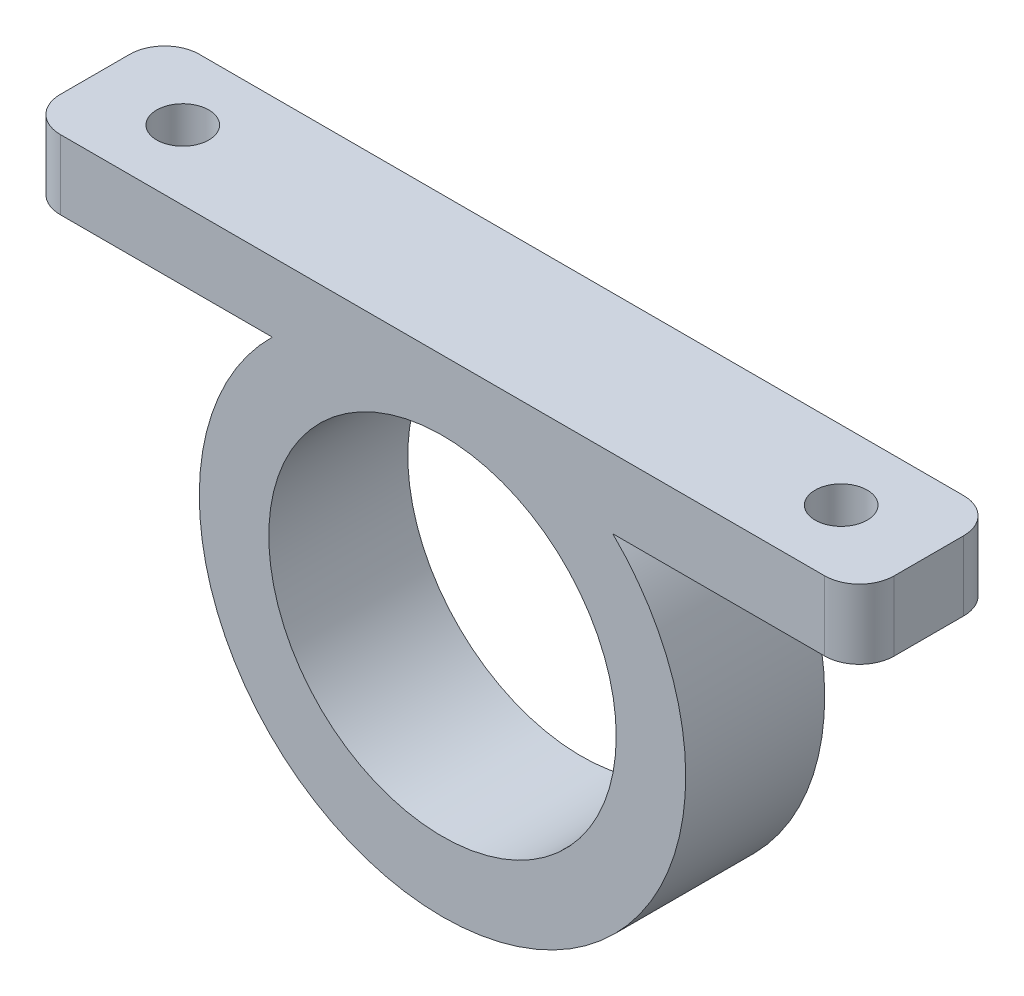
ISO-10303-21;
HEADER;
FILE_DESCRIPTION(('STEP AP214'),'2;1');
FILE_NAME('part.step','',(''),(''),'','','');
FILE_SCHEMA(('AUTOMOTIVE_DESIGN { 1 0 10303 214 1 1 1 1 }'));
ENDSEC;
DATA;
#1=APPLICATION_CONTEXT('core data for automotive mechanical design processes');
#2=APPLICATION_PROTOCOL_DEFINITION('international standard','automotive_design',2000,#1);
#3=PRODUCT_CONTEXT('',#1,'mechanical');
#4=PRODUCT('Part','Part','',(#3));
#5=PRODUCT_RELATED_PRODUCT_CATEGORY('part','',(#4));
#6=PRODUCT_DEFINITION_FORMATION('','',#4);
#7=PRODUCT_DEFINITION_CONTEXT('part definition',#1,'design');
#8=PRODUCT_DEFINITION('design','',#6,#7);
#9=PRODUCT_DEFINITION_SHAPE('','',#8);
#10=(LENGTH_UNIT() NAMED_UNIT(*) SI_UNIT(.MILLI.,.METRE.));
#11=(NAMED_UNIT(*) PLANE_ANGLE_UNIT() SI_UNIT($,.RADIAN.));
#12=(NAMED_UNIT(*) SI_UNIT($,.STERADIAN.) SOLID_ANGLE_UNIT());
#13=UNCERTAINTY_MEASURE_WITH_UNIT(LENGTH_MEASURE(1.E-05),#10,'distance_accuracy_value','');
#14=(GEOMETRIC_REPRESENTATION_CONTEXT(3) GLOBAL_UNCERTAINTY_ASSIGNED_CONTEXT((#13)) GLOBAL_UNIT_ASSIGNED_CONTEXT((#10,
#11,#12)) REPRESENTATION_CONTEXT('',''));
#15=CARTESIAN_POINT('',(0.,0.,0.));
#16=DIRECTION('',(0.,0.,1.));
#17=DIRECTION('',(1.,0.,0.));
#18=AXIS2_PLACEMENT_3D('',#15,#16,#17);
#19=CARTESIAN_POINT('',(0.,0.,8.));
#20=DIRECTION('',(0.,0.,1.));
#21=DIRECTION('',(1.,0.,0.));
#22=AXIS2_PLACEMENT_3D('',#19,#20,#21);
#23=PLANE('',#22);
#24=DIRECTION('',(1.,0.,0.));
#25=VECTOR('',#24,1.);
#26=CARTESIAN_POINT('',(24.,10.,8.));
#27=LINE('',#26,#25);
#28=CARTESIAN_POINT('',(9.79795897113272,9.99999999999999,8.));
#29=VERTEX_POINT('',#28);
#30=CARTESIAN_POINT('',(22.,10.,8.));
#31=VERTEX_POINT('',#30);
#32=EDGE_CURVE('E109',#29,#31,#27,.T.);
#33=ORIENTED_EDGE('',*,*,#32,.T.);
#34=DIRECTION('',(0.,1.,0.));
#35=VECTOR('',#34,1.);
#36=CARTESIAN_POINT('',(22.,14.,8.));
#37=LINE('',#36,#35);
#38=CARTESIAN_POINT('',(22.,14.,8.));
#39=VERTEX_POINT('',#38);
#40=EDGE_CURVE('E140',#31,#39,#37,.T.);
#41=ORIENTED_EDGE('',*,*,#40,.T.);
#42=DIRECTION('',(-1.,0.,0.));
#43=VECTOR('',#42,1.);
#44=CARTESIAN_POINT('',(0.,14.,8.));
#45=LINE('',#44,#43);
#46=CARTESIAN_POINT('',(-22.,14.,8.));
#47=VERTEX_POINT('',#46);
#48=EDGE_CURVE('E122',#39,#47,#45,.T.);
#49=ORIENTED_EDGE('',*,*,#48,.T.);
#50=DIRECTION('',(0.,-1.,0.));
#51=VECTOR('',#50,1.);
#52=CARTESIAN_POINT('',(-22.,10.,8.));
#53=LINE('',#52,#51);
#54=CARTESIAN_POINT('',(-22.,10.,8.));
#55=VERTEX_POINT('',#54);
#56=EDGE_CURVE('E137',#47,#55,#53,.T.);
#57=ORIENTED_EDGE('',*,*,#56,.T.);
#58=DIRECTION('',(1.,0.,0.));
#59=VECTOR('',#58,1.);
#60=CARTESIAN_POINT('',(-24.,10.,8.));
#61=LINE('',#60,#59);
#62=CARTESIAN_POINT('',(-9.79795897113272,10.,8.));
#63=VERTEX_POINT('',#62);
#64=EDGE_CURVE('E128',#55,#63,#61,.T.);
#65=ORIENTED_EDGE('',*,*,#64,.T.);
#66=CARTESIAN_POINT('',(0.,0.,8.));
#67=DIRECTION('',(0.,0.,1.));
#68=DIRECTION('',(1.,0.,0.));
#69=AXIS2_PLACEMENT_3D('',#66,#67,#68);
#70=CIRCLE('',#69,14.);
#71=EDGE_CURVE('E123',#63,#29,#70,.T.);
#72=ORIENTED_EDGE('',*,*,#71,.T.);
#73=EDGE_LOOP('',(#33,#41,#49,#57,#65,#72));
#74=FACE_BOUND('',#73,.T.);
#75=CARTESIAN_POINT('',(0.,0.,8.));
#76=DIRECTION('',(0.,0.,1.));
#77=DIRECTION('',(1.,0.,0.));
#78=AXIS2_PLACEMENT_3D('',#75,#76,#77);
#79=CIRCLE('',#78,10.);
#80=CARTESIAN_POINT('',(10.,0.,8.));
#81=VERTEX_POINT('',#80);
#82=EDGE_CURVE('E207',#81,#81,#79,.T.);
#83=ORIENTED_EDGE('',*,*,#82,.F.);
#84=EDGE_LOOP('',(#83));
#85=FACE_BOUND('',#84,.T.);
#86=ADVANCED_FACE('F33',(#74,#85),#23,.T.);
#87=CARTESIAN_POINT('',(0.,0.,0.));
#88=DIRECTION('',(0.,0.,1.));
#89=DIRECTION('',(1.,0.,0.));
#90=AXIS2_PLACEMENT_3D('',#87,#88,#89);
#91=PLANE('',#90);
#92=DIRECTION('',(-1.,0.,0.));
#93=VECTOR('',#92,1.);
#94=CARTESIAN_POINT('',(0.,14.,0.));
#95=LINE('',#94,#93);
#96=CARTESIAN_POINT('',(22.,14.,0.));
#97=VERTEX_POINT('',#96);
#98=CARTESIAN_POINT('',(-22.,14.,0.));
#99=VERTEX_POINT('',#98);
#100=EDGE_CURVE('E209',#97,#99,#95,.T.);
#101=ORIENTED_EDGE('',*,*,#100,.F.);
#102=DIRECTION('',(0.,1.,0.));
#103=VECTOR('',#102,1.);
#104=CARTESIAN_POINT('',(22.,0.,0.));
#105=LINE('',#104,#103);
#106=CARTESIAN_POINT('',(22.,10.,0.));
#107=VERTEX_POINT('',#106);
#108=EDGE_CURVE('E166',#97,#107,#105,.F.);
#109=ORIENTED_EDGE('',*,*,#108,.T.);
#110=DIRECTION('',(1.,0.,0.));
#111=VECTOR('',#110,1.);
#112=CARTESIAN_POINT('',(24.,10.,0.));
#113=LINE('',#112,#111);
#114=CARTESIAN_POINT('',(9.79795897113272,9.99999999999999,0.));
#115=VERTEX_POINT('',#114);
#116=EDGE_CURVE('E206',#115,#107,#113,.T.);
#117=ORIENTED_EDGE('',*,*,#116,.F.);
#118=CARTESIAN_POINT('',(0.,0.,0.));
#119=DIRECTION('',(0.,0.,1.));
#120=DIRECTION('',(1.,0.,0.));
#121=AXIS2_PLACEMENT_3D('',#118,#119,#120);
#122=CIRCLE('',#121,14.);
#123=CARTESIAN_POINT('',(-9.79795897113272,10.,0.));
#124=VERTEX_POINT('',#123);
#125=EDGE_CURVE('E136',#124,#115,#122,.T.);
#126=ORIENTED_EDGE('',*,*,#125,.F.);
#127=DIRECTION('',(1.,0.,0.));
#128=VECTOR('',#127,1.);
#129=CARTESIAN_POINT('',(-24.,10.,0.));
#130=LINE('',#129,#128);
#131=CARTESIAN_POINT('',(-22.,10.,0.));
#132=VERTEX_POINT('',#131);
#133=EDGE_CURVE('E132',#132,#124,#130,.T.);
#134=ORIENTED_EDGE('',*,*,#133,.F.);
#135=DIRECTION('',(0.,-1.,0.));
#136=VECTOR('',#135,1.);
#137=CARTESIAN_POINT('',(-22.,0.,0.));
#138=LINE('',#137,#136);
#139=EDGE_CURVE('E164',#132,#99,#138,.F.);
#140=ORIENTED_EDGE('',*,*,#139,.T.);
#141=EDGE_LOOP('',(#101,#109,#117,#126,#134,#140));
#142=FACE_BOUND('',#141,.T.);
#143=CARTESIAN_POINT('',(0.,0.,0.));
#144=DIRECTION('',(0.,0.,1.));
#145=DIRECTION('',(1.,0.,0.));
#146=AXIS2_PLACEMENT_3D('',#143,#144,#145);
#147=CIRCLE('',#146,10.);
#148=CARTESIAN_POINT('',(10.,0.,0.));
#149=VERTEX_POINT('',#148);
#150=EDGE_CURVE('E338',#149,#149,#147,.T.);
#151=ORIENTED_EDGE('',*,*,#150,.T.);
#152=EDGE_LOOP('',(#151));
#153=FACE_BOUND('',#152,.T.);
#154=ADVANCED_FACE('F211',(#142,#153),#91,.F.);
#155=CARTESIAN_POINT('',(0.,0.,8.));
#156=DIRECTION('',(0.,0.,-1.));
#157=DIRECTION('',(-1.,0.,0.));
#158=AXIS2_PLACEMENT_3D('',#155,#156,#157);
#159=CYLINDRICAL_SURFACE('',#158,14.);
#160=ORIENTED_EDGE('',*,*,#125,.T.);
#161=DIRECTION('',(0.,0.,-1.));
#162=VECTOR('',#161,1.);
#163=CARTESIAN_POINT('',(9.79795897113272,9.99999999999999,8.));
#164=LINE('',#163,#162);
#165=EDGE_CURVE('E115',#29,#115,#164,.T.);
#166=ORIENTED_EDGE('',*,*,#165,.F.);
#167=ORIENTED_EDGE('',*,*,#71,.F.);
#168=DIRECTION('',(0.,0.,-1.));
#169=VECTOR('',#168,1.);
#170=CARTESIAN_POINT('',(-9.79795897113272,10.,8.));
#171=LINE('',#170,#169);
#172=EDGE_CURVE('E181',#63,#124,#171,.T.);
#173=ORIENTED_EDGE('',*,*,#172,.T.);
#174=EDGE_LOOP('',(#160,#166,#167,#173));
#175=FACE_BOUND('',#174,.T.);
#176=ADVANCED_FACE('F134',(#175),#159,.T.);
#177=CARTESIAN_POINT('',(24.,10.,8.));
#178=DIRECTION('',(0.,1.,0.));
#179=DIRECTION('',(-1.,0.,0.));
#180=AXIS2_PLACEMENT_3D('',#177,#178,#179);
#181=PLANE('',#180);
#182=CARTESIAN_POINT('',(18.9494897427832,10.,4.));
#183=DIRECTION('',(0.,-1.,0.));
#184=DIRECTION('',(0.,0.,-1.));
#185=AXIS2_PLACEMENT_3D('',#182,#183,#184);
#186=CIRCLE('',#185,1.5);
#187=CARTESIAN_POINT('',(18.9494897427832,10.,2.5));
#188=VERTEX_POINT('',#187);
#189=EDGE_CURVE('E330',#188,#188,#186,.T.);
#190=ORIENTED_EDGE('',*,*,#189,.F.);
#191=EDGE_LOOP('',(#190));
#192=FACE_BOUND('',#191,.T.);
#193=DIRECTION('',(0.,0.,-1.));
#194=VECTOR('',#193,1.);
#195=CARTESIAN_POINT('',(24.,10.,8.));
#196=LINE('',#195,#194);
#197=CARTESIAN_POINT('',(24.,10.,6.));
#198=VERTEX_POINT('',#197);
#199=CARTESIAN_POINT('',(24.,10.,2.));
#200=VERTEX_POINT('',#199);
#201=EDGE_CURVE('E138',#198,#200,#196,.T.);
#202=ORIENTED_EDGE('',*,*,#201,.F.);
#203=CARTESIAN_POINT('',(22.,10.,6.));
#204=DIRECTION('',(0.,1.,0.));
#205=DIRECTION('',(-1.,0.,0.));
#206=AXIS2_PLACEMENT_3D('',#203,#204,#205);
#207=CIRCLE('',#206,2.);
#208=EDGE_CURVE('E118',#198,#31,#207,.F.);
#209=ORIENTED_EDGE('',*,*,#208,.T.);
#210=ORIENTED_EDGE('',*,*,#32,.F.);
#211=ORIENTED_EDGE('',*,*,#165,.T.);
#212=ORIENTED_EDGE('',*,*,#116,.T.);
#213=CARTESIAN_POINT('',(22.,9.99999999999999,2.));
#214=DIRECTION('',(0.,1.,0.));
#215=DIRECTION('',(-1.,0.,0.));
#216=AXIS2_PLACEMENT_3D('',#213,#214,#215);
#217=CIRCLE('',#216,2.);
#218=EDGE_CURVE('E161',#107,#200,#217,.F.);
#219=ORIENTED_EDGE('',*,*,#218,.T.);
#220=EDGE_LOOP('',(#202,#209,#210,#211,#212,#219));
#221=FACE_BOUND('',#220,.T.);
#222=ADVANCED_FACE('F112',(#192,#221),#181,.F.);
#223=CARTESIAN_POINT('',(24.,14.,8.));
#224=DIRECTION('',(-1.,0.,0.));
#225=DIRECTION('',(0.,0.,1.));
#226=AXIS2_PLACEMENT_3D('',#223,#224,#225);
#227=PLANE('',#226);
#228=DIRECTION('',(0.,0.,-1.));
#229=VECTOR('',#228,1.);
#230=CARTESIAN_POINT('',(24.,14.,8.));
#231=LINE('',#230,#229);
#232=CARTESIAN_POINT('',(24.,14.,6.));
#233=VERTEX_POINT('',#232);
#234=CARTESIAN_POINT('',(24.,14.,2.));
#235=VERTEX_POINT('',#234);
#236=EDGE_CURVE('E143',#233,#235,#231,.T.);
#237=ORIENTED_EDGE('',*,*,#236,.F.);
#238=DIRECTION('',(0.,1.,0.));
#239=VECTOR('',#238,1.);
#240=CARTESIAN_POINT('',(24.,10.,6.));
#241=LINE('',#240,#239);
#242=EDGE_CURVE('E159',#233,#198,#241,.F.);
#243=ORIENTED_EDGE('',*,*,#242,.T.);
#244=ORIENTED_EDGE('',*,*,#201,.T.);
#245=DIRECTION('',(0.,1.,0.));
#246=VECTOR('',#245,1.);
#247=CARTESIAN_POINT('',(24.,14.,2.));
#248=LINE('',#247,#246);
#249=EDGE_CURVE('E156',#200,#235,#248,.T.);
#250=ORIENTED_EDGE('',*,*,#249,.T.);
#251=EDGE_LOOP('',(#237,#243,#244,#250));
#252=FACE_BOUND('',#251,.T.);
#253=ADVANCED_FACE('F195',(#252),#227,.F.);
#254=CARTESIAN_POINT('',(0.,14.,8.));
#255=DIRECTION('',(0.,-1.,0.));
#256=DIRECTION('',(1.,0.,0.));
#257=AXIS2_PLACEMENT_3D('',#254,#255,#256);
#258=PLANE('',#257);
#259=CARTESIAN_POINT('',(18.9494897427832,14.,4.));
#260=DIRECTION('',(0.,-1.,0.));
#261=DIRECTION('',(0.,0.,-1.));
#262=AXIS2_PLACEMENT_3D('',#259,#260,#261);
#263=CIRCLE('',#262,1.5);
#264=CARTESIAN_POINT('',(18.9494897427832,14.,2.5));
#265=VERTEX_POINT('',#264);
#266=EDGE_CURVE('E327',#265,#265,#263,.T.);
#267=ORIENTED_EDGE('',*,*,#266,.T.);
#268=EDGE_LOOP('',(#267));
#269=FACE_BOUND('',#268,.T.);
#270=CARTESIAN_POINT('',(-18.9494897427832,14.,4.));
#271=DIRECTION('',(0.,-1.,0.));
#272=DIRECTION('',(0.,0.,-1.));
#273=AXIS2_PLACEMENT_3D('',#270,#271,#272);
#274=CIRCLE('',#273,1.5);
#275=CARTESIAN_POINT('',(-18.9494897427832,14.,2.5));
#276=VERTEX_POINT('',#275);
#277=EDGE_CURVE('E335',#276,#276,#274,.T.);
#278=ORIENTED_EDGE('',*,*,#277,.T.);
#279=EDGE_LOOP('',(#278));
#280=FACE_BOUND('',#279,.T.);
#281=ORIENTED_EDGE('',*,*,#48,.F.);
#282=CARTESIAN_POINT('',(22.,14.,6.));
#283=DIRECTION('',(0.,-1.,0.));
#284=DIRECTION('',(1.,0.,0.));
#285=AXIS2_PLACEMENT_3D('',#282,#283,#284);
#286=CIRCLE('',#285,2.);
#287=EDGE_CURVE('E154',#39,#233,#286,.F.);
#288=ORIENTED_EDGE('',*,*,#287,.T.);
#289=ORIENTED_EDGE('',*,*,#236,.T.);
#290=CARTESIAN_POINT('',(22.,14.,2.));
#291=DIRECTION('',(0.,-1.,0.));
#292=DIRECTION('',(1.,0.,0.));
#293=AXIS2_PLACEMENT_3D('',#290,#291,#292);
#294=CIRCLE('',#293,2.);
#295=EDGE_CURVE('E152',#235,#97,#294,.F.);
#296=ORIENTED_EDGE('',*,*,#295,.T.);
#297=ORIENTED_EDGE('',*,*,#100,.T.);
#298=CARTESIAN_POINT('',(-22.,14.,2.));
#299=DIRECTION('',(0.,-1.,0.));
#300=DIRECTION('',(1.,0.,0.));
#301=AXIS2_PLACEMENT_3D('',#298,#299,#300);
#302=CIRCLE('',#301,2.);
#303=CARTESIAN_POINT('',(-24.,14.,2.));
#304=VERTEX_POINT('',#303);
#305=EDGE_CURVE('E150',#99,#304,#302,.F.);
#306=ORIENTED_EDGE('',*,*,#305,.T.);
#307=DIRECTION('',(0.,0.,-1.));
#308=VECTOR('',#307,1.);
#309=CARTESIAN_POINT('',(-24.,14.,8.));
#310=LINE('',#309,#308);
#311=CARTESIAN_POINT('',(-24.,14.,6.));
#312=VERTEX_POINT('',#311);
#313=EDGE_CURVE('E177',#312,#304,#310,.T.);
#314=ORIENTED_EDGE('',*,*,#313,.F.);
#315=CARTESIAN_POINT('',(-22.,14.,6.));
#316=DIRECTION('',(0.,-1.,0.));
#317=DIRECTION('',(1.,0.,0.));
#318=AXIS2_PLACEMENT_3D('',#315,#316,#317);
#319=CIRCLE('',#318,2.);
#320=EDGE_CURVE('E148',#312,#47,#319,.F.);
#321=ORIENTED_EDGE('',*,*,#320,.T.);
#322=EDGE_LOOP('',(#281,#288,#289,#296,#297,#306,#314,#321));
#323=FACE_BOUND('',#322,.T.);
#324=ADVANCED_FACE('F190',(#269,#280,#323),#258,.F.);
#325=CARTESIAN_POINT('',(-24.,14.,8.));
#326=DIRECTION('',(1.,0.,0.));
#327=DIRECTION('',(0.,0.,-1.));
#328=AXIS2_PLACEMENT_3D('',#325,#326,#327);
#329=PLANE('',#328);
#330=ORIENTED_EDGE('',*,*,#313,.T.);
#331=DIRECTION('',(0.,-1.,0.));
#332=VECTOR('',#331,1.);
#333=CARTESIAN_POINT('',(-24.,14.,2.));
#334=LINE('',#333,#332);
#335=CARTESIAN_POINT('',(-24.,10.,2.));
#336=VERTEX_POINT('',#335);
#337=EDGE_CURVE('E170',#304,#336,#334,.T.);
#338=ORIENTED_EDGE('',*,*,#337,.T.);
#339=DIRECTION('',(0.,0.,-1.));
#340=VECTOR('',#339,1.);
#341=CARTESIAN_POINT('',(-24.,10.,8.));
#342=LINE('',#341,#340);
#343=CARTESIAN_POINT('',(-24.,10.,6.));
#344=VERTEX_POINT('',#343);
#345=EDGE_CURVE('E174',#344,#336,#342,.T.);
#346=ORIENTED_EDGE('',*,*,#345,.F.);
#347=DIRECTION('',(0.,-1.,0.));
#348=VECTOR('',#347,1.);
#349=CARTESIAN_POINT('',(-24.,14.,6.));
#350=LINE('',#349,#348);
#351=EDGE_CURVE('E168',#344,#312,#350,.F.);
#352=ORIENTED_EDGE('',*,*,#351,.T.);
#353=EDGE_LOOP('',(#330,#338,#346,#352));
#354=FACE_BOUND('',#353,.T.);
#355=ADVANCED_FACE('F173',(#354),#329,.F.);
#356=CARTESIAN_POINT('',(-24.,10.,8.));
#357=DIRECTION('',(0.,1.,0.));
#358=DIRECTION('',(0.,0.,1.));
#359=AXIS2_PLACEMENT_3D('',#356,#357,#358);
#360=PLANE('',#359);
#361=CARTESIAN_POINT('',(-18.9494897427832,10.,4.));
#362=DIRECTION('',(0.,-1.,0.));
#363=DIRECTION('',(0.,0.,-1.));
#364=AXIS2_PLACEMENT_3D('',#361,#362,#363);
#365=CIRCLE('',#364,1.5);
#366=CARTESIAN_POINT('',(-18.9494897427832,10.,2.5));
#367=VERTEX_POINT('',#366);
#368=EDGE_CURVE('E332',#367,#367,#365,.T.);
#369=ORIENTED_EDGE('',*,*,#368,.F.);
#370=EDGE_LOOP('',(#369));
#371=FACE_BOUND('',#370,.T.);
#372=ORIENTED_EDGE('',*,*,#345,.T.);
#373=CARTESIAN_POINT('',(-22.,10.,2.));
#374=DIRECTION('',(0.,1.,0.));
#375=DIRECTION('',(0.,0.,1.));
#376=AXIS2_PLACEMENT_3D('',#373,#374,#375);
#377=CIRCLE('',#376,2.);
#378=EDGE_CURVE('E11',#336,#132,#377,.F.);
#379=ORIENTED_EDGE('',*,*,#378,.T.);
#380=ORIENTED_EDGE('',*,*,#133,.T.);
#381=ORIENTED_EDGE('',*,*,#172,.F.);
#382=ORIENTED_EDGE('',*,*,#64,.F.);
#383=CARTESIAN_POINT('',(-22.,10.,6.));
#384=DIRECTION('',(0.,1.,0.));
#385=DIRECTION('',(0.,0.,1.));
#386=AXIS2_PLACEMENT_3D('',#383,#384,#385);
#387=CIRCLE('',#386,2.);
#388=EDGE_CURVE('E41',#55,#344,#387,.F.);
#389=ORIENTED_EDGE('',*,*,#388,.T.);
#390=EDGE_LOOP('',(#372,#379,#380,#381,#382,#389));
#391=FACE_BOUND('',#390,.T.);
#392=ADVANCED_FACE('F179',(#371,#391),#360,.F.);
#393=CARTESIAN_POINT('',(0.,0.,8.));
#394=DIRECTION('',(0.,0.,-1.));
#395=DIRECTION('',(-1.,0.,0.));
#396=AXIS2_PLACEMENT_3D('',#393,#394,#395);
#397=CYLINDRICAL_SURFACE('',#396,10.);
#398=ORIENTED_EDGE('',*,*,#82,.T.);
#399=EDGE_LOOP('',(#398));
#400=FACE_BOUND('',#399,.T.);
#401=ORIENTED_EDGE('',*,*,#150,.F.);
#402=EDGE_LOOP('',(#401));
#403=FACE_BOUND('',#402,.T.);
#404=ADVANCED_FACE('F224',(#400,#403),#397,.F.);
#405=CARTESIAN_POINT('',(22.,0.,6.));
#406=DIRECTION('',(0.,-1.,0.));
#407=DIRECTION('',(0.,0.,-1.));
#408=AXIS2_PLACEMENT_3D('',#405,#406,#407);
#409=CYLINDRICAL_SURFACE('',#408,2.);
#410=ORIENTED_EDGE('',*,*,#208,.F.);
#411=ORIENTED_EDGE('',*,*,#242,.F.);
#412=ORIENTED_EDGE('',*,*,#287,.F.);
#413=ORIENTED_EDGE('',*,*,#40,.F.);
#414=EDGE_LOOP('',(#410,#411,#412,#413));
#415=FACE_BOUND('',#414,.T.);
#416=ADVANCED_FACE('F198',(#415),#409,.T.);
#417=CARTESIAN_POINT('',(22.,14.,2.));
#418=DIRECTION('',(0.,1.,0.));
#419=DIRECTION('',(0.,0.,1.));
#420=AXIS2_PLACEMENT_3D('',#417,#418,#419);
#421=CYLINDRICAL_SURFACE('',#420,2.);
#422=ORIENTED_EDGE('',*,*,#218,.F.);
#423=ORIENTED_EDGE('',*,*,#108,.F.);
#424=ORIENTED_EDGE('',*,*,#295,.F.);
#425=ORIENTED_EDGE('',*,*,#249,.F.);
#426=EDGE_LOOP('',(#422,#423,#424,#425));
#427=FACE_BOUND('',#426,.T.);
#428=ADVANCED_FACE('F216',(#427),#421,.T.);
#429=CARTESIAN_POINT('',(-22.,14.,2.));
#430=DIRECTION('',(0.,-1.,0.));
#431=DIRECTION('',(0.,0.,-1.));
#432=AXIS2_PLACEMENT_3D('',#429,#430,#431);
#433=CYLINDRICAL_SURFACE('',#432,2.);
#434=ORIENTED_EDGE('',*,*,#305,.F.);
#435=ORIENTED_EDGE('',*,*,#139,.F.);
#436=ORIENTED_EDGE('',*,*,#378,.F.);
#437=ORIENTED_EDGE('',*,*,#337,.F.);
#438=EDGE_LOOP('',(#434,#435,#436,#437));
#439=FACE_BOUND('',#438,.T.);
#440=ADVANCED_FACE('F218',(#439),#433,.T.);
#441=CARTESIAN_POINT('',(-22.,0.,6.));
#442=DIRECTION('',(0.,1.,0.));
#443=DIRECTION('',(0.,0.,1.));
#444=AXIS2_PLACEMENT_3D('',#441,#442,#443);
#445=CYLINDRICAL_SURFACE('',#444,2.);
#446=ORIENTED_EDGE('',*,*,#320,.F.);
#447=ORIENTED_EDGE('',*,*,#351,.F.);
#448=ORIENTED_EDGE('',*,*,#388,.F.);
#449=ORIENTED_EDGE('',*,*,#56,.F.);
#450=EDGE_LOOP('',(#446,#447,#448,#449));
#451=FACE_BOUND('',#450,.T.);
#452=ADVANCED_FACE('F35',(#451),#445,.T.);
#453=CARTESIAN_POINT('',(-18.9494897427832,14.,4.));
#454=DIRECTION('',(0.,-1.,0.));
#455=DIRECTION('',(0.,0.,-1.));
#456=AXIS2_PLACEMENT_3D('',#453,#454,#455);
#457=CYLINDRICAL_SURFACE('',#456,1.5);
#458=ORIENTED_EDGE('',*,*,#277,.F.);
#459=EDGE_LOOP('',(#458));
#460=FACE_BOUND('',#459,.T.);
#461=ORIENTED_EDGE('',*,*,#368,.T.);
#462=EDGE_LOOP('',(#461));
#463=FACE_BOUND('',#462,.T.);
#464=ADVANCED_FACE('F302',(#460,#463),#457,.F.);
#465=CARTESIAN_POINT('',(18.9494897427832,14.,4.));
#466=DIRECTION('',(0.,-1.,0.));
#467=DIRECTION('',(0.,0.,-1.));
#468=AXIS2_PLACEMENT_3D('',#465,#466,#467);
#469=CYLINDRICAL_SURFACE('',#468,1.5);
#470=ORIENTED_EDGE('',*,*,#266,.F.);
#471=EDGE_LOOP('',(#470));
#472=FACE_BOUND('',#471,.T.);
#473=ORIENTED_EDGE('',*,*,#189,.T.);
#474=EDGE_LOOP('',(#473));
#475=FACE_BOUND('',#474,.T.);
#476=ADVANCED_FACE('F311',(#472,#475),#469,.F.);
#477=CLOSED_SHELL('',(#86,#154,#176,#222,#253,#324,#355,#392,#404,#416,#428,#440,#452,#464,#476));
#478=MANIFOLD_SOLID_BREP('B2',#477);
#479=ADVANCED_BREP_SHAPE_REPRESENTATION('',(#18,#478),#14);
#480=SHAPE_DEFINITION_REPRESENTATION(#9,#479);
ENDSEC;
END-ISO-10303-21;
